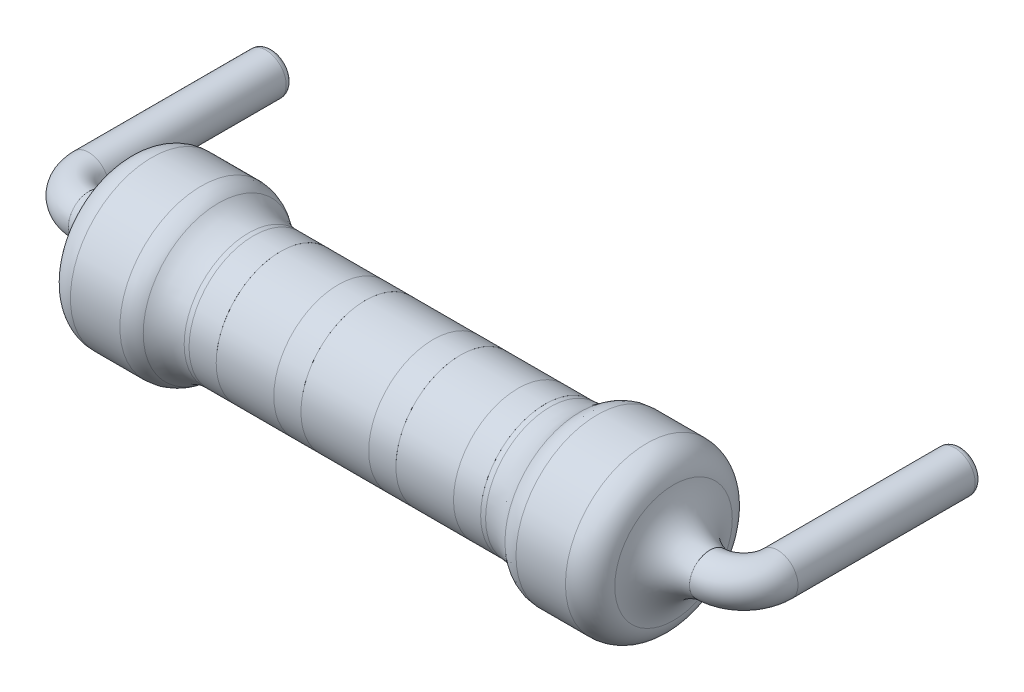
ISO-10303-21;
HEADER;
FILE_DESCRIPTION(('STEP AP214'),'2;1');
FILE_NAME('part.step','',(''),(''),'','','');
FILE_SCHEMA(('AUTOMOTIVE_DESIGN { 1 0 10303 214 1 1 1 1 }'));
ENDSEC;
DATA;
#1=APPLICATION_CONTEXT('core data for automotive mechanical design processes');
#2=APPLICATION_PROTOCOL_DEFINITION('international standard','automotive_design',2000,#1);
#3=PRODUCT_CONTEXT('',#1,'mechanical');
#4=PRODUCT('Part','Part','',(#3));
#5=PRODUCT_RELATED_PRODUCT_CATEGORY('part','',(#4));
#6=PRODUCT_DEFINITION_FORMATION('','',#4);
#7=PRODUCT_DEFINITION_CONTEXT('part definition',#1,'design');
#8=PRODUCT_DEFINITION('design','',#6,#7);
#9=PRODUCT_DEFINITION_SHAPE('','',#8);
#10=(LENGTH_UNIT() NAMED_UNIT(*) SI_UNIT(.MILLI.,.METRE.));
#11=(NAMED_UNIT(*) PLANE_ANGLE_UNIT() SI_UNIT($,.RADIAN.));
#12=(NAMED_UNIT(*) SI_UNIT($,.STERADIAN.) SOLID_ANGLE_UNIT());
#13=UNCERTAINTY_MEASURE_WITH_UNIT(LENGTH_MEASURE(1.E-05),#10,'distance_accuracy_value','');
#14=(GEOMETRIC_REPRESENTATION_CONTEXT(3) GLOBAL_UNCERTAINTY_ASSIGNED_CONTEXT((#13)) GLOBAL_UNIT_ASSIGNED_CONTEXT((#10,
#11,#12)) REPRESENTATION_CONTEXT('',''));
#15=CARTESIAN_POINT('',(0.,0.,0.));
#16=DIRECTION('',(0.,0.,1.));
#17=DIRECTION('',(1.,0.,0.));
#18=AXIS2_PLACEMENT_3D('',#15,#16,#17);
#19=CARTESIAN_POINT('',(-5.08,0.,-1.99999999999996));
#20=DIRECTION('',(-1.33226762955019E-13,0.,1.));
#21=DIRECTION('',(1.,0.,1.33226762955019E-13));
#22=AXIS2_PLACEMENT_3D('',#19,#20,#21);
#23=PLANE('',#22);
#24=CARTESIAN_POINT('',(-5.07999999999999,0.,-1.99999999999996));
#25=DIRECTION('',(-1.33226762955019E-13,0.,1.));
#26=DIRECTION('',(1.,0.,1.32272665043232E-13));
#27=AXIS2_PLACEMENT_3D('',#24,#25,#26);
#28=CIRCLE('',#27,0.2);
#29=CARTESIAN_POINT('',(-4.87999999999999,0.,-1.99999999999994));
#30=VERTEX_POINT('',#29);
#31=CARTESIAN_POINT('',(-5.27999999999999,0.,-1.99999999999999));
#32=VERTEX_POINT('',#31);
#33=EDGE_CURVE('E330',#30,#32,#28,.T.);
#34=ORIENTED_EDGE('',*,*,#33,.F.);
#35=CARTESIAN_POINT('',(-5.07999999999999,0.,-1.99999999999996));
#36=DIRECTION('',(-1.33226762955019E-13,0.,1.));
#37=DIRECTION('',(-1.,0.,-1.32272665043232E-13));
#38=AXIS2_PLACEMENT_3D('',#35,#36,#37);
#39=CIRCLE('',#38,0.2);
#40=EDGE_CURVE('E348',#32,#30,#39,.T.);
#41=ORIENTED_EDGE('',*,*,#40,.F.);
#42=EDGE_LOOP('',(#34,#41));
#43=FACE_BOUND('',#42,.T.);
#44=ADVANCED_FACE('F17',(#43),#23,.F.);
#45=CARTESIAN_POINT('',(5.08,0.,-2.00000000000004));
#46=DIRECTION('',(0.,0.,-1.));
#47=DIRECTION('',(-1.,0.,0.));
#48=AXIS2_PLACEMENT_3D('',#45,#46,#47);
#49=PLANE('',#48);
#50=CARTESIAN_POINT('',(5.08,0.,-2.00000000000004));
#51=DIRECTION('',(0.,0.,1.));
#52=DIRECTION('',(1.,0.,0.));
#53=AXIS2_PLACEMENT_3D('',#50,#51,#52);
#54=CIRCLE('',#53,0.2);
#55=CARTESIAN_POINT('',(5.28,0.,-2.00000000000004));
#56=VERTEX_POINT('',#55);
#57=CARTESIAN_POINT('',(4.88,0.,-2.00000000000003));
#58=VERTEX_POINT('',#57);
#59=EDGE_CURVE('E353',#56,#58,#54,.T.);
#60=ORIENTED_EDGE('',*,*,#59,.F.);
#61=CARTESIAN_POINT('',(5.08,0.,-2.00000000000004));
#62=DIRECTION('',(0.,0.,1.));
#63=DIRECTION('',(-1.,0.,0.));
#64=AXIS2_PLACEMENT_3D('',#61,#62,#63);
#65=CIRCLE('',#64,0.2);
#66=EDGE_CURVE('E38',#58,#56,#65,.T.);
#67=ORIENTED_EDGE('',*,*,#66,.F.);
#68=EDGE_LOOP('',(#60,#67));
#69=FACE_BOUND('',#68,.T.);
#70=ADVANCED_FACE('F503',(#69),#49,.T.);
#71=CARTESIAN_POINT('',(-5.08,0.,-1.89999999999997));
#72=DIRECTION('',(-1.33226762955019E-13,0.,1.));
#73=DIRECTION('',(1.,0.,1.33226762955019E-13));
#74=AXIS2_PLACEMENT_3D('',#71,#72,#73);
#75=TOROIDAL_SURFACE('',#74,0.200000000000001,0.1);
#76=ORIENTED_EDGE('',*,*,#33,.T.);
#77=ORIENTED_EDGE('',*,*,#40,.T.);
#78=EDGE_LOOP('',(#76,#77));
#79=FACE_BOUND('',#78,.T.);
#80=CARTESIAN_POINT('',(-5.08,0.,-1.90000000000002));
#81=DIRECTION('',(0.,0.,-1.));
#82=DIRECTION('',(-1.,0.,0.));
#83=AXIS2_PLACEMENT_3D('',#80,#81,#82);
#84=CIRCLE('',#83,0.3);
#85=CARTESIAN_POINT('',(-5.38,0.,-1.90000000000002));
#86=VERTEX_POINT('',#85);
#87=EDGE_CURVE('E358',#86,#86,#84,.F.);
#88=ORIENTED_EDGE('',*,*,#87,.F.);
#89=EDGE_LOOP('',(#88));
#90=FACE_BOUND('',#89,.T.);
#91=ADVANCED_FACE('F488',(#79,#90),#75,.T.);
#92=CARTESIAN_POINT('',(5.08,0.,-1.90000000000004));
#93=DIRECTION('',(0.,0.,-1.));
#94=DIRECTION('',(-1.,0.,0.));
#95=AXIS2_PLACEMENT_3D('',#92,#93,#94);
#96=TOROIDAL_SURFACE('',#95,0.200000000000001,0.1);
#97=ORIENTED_EDGE('',*,*,#66,.T.);
#98=ORIENTED_EDGE('',*,*,#59,.T.);
#99=EDGE_LOOP('',(#97,#98));
#100=FACE_BOUND('',#99,.T.);
#101=CARTESIAN_POINT('',(5.08,0.,-1.90000000000004));
#102=DIRECTION('',(0.,0.,-1.));
#103=DIRECTION('',(-1.,0.,0.));
#104=AXIS2_PLACEMENT_3D('',#101,#102,#103);
#105=CIRCLE('',#104,0.3);
#106=CARTESIAN_POINT('',(4.78,0.,-1.90000000000004));
#107=VERTEX_POINT('',#106);
#108=EDGE_CURVE('E363',#107,#107,#105,.F.);
#109=ORIENTED_EDGE('',*,*,#108,.F.);
#110=EDGE_LOOP('',(#109));
#111=FACE_BOUND('',#110,.T.);
#112=ADVANCED_FACE('F477',(#100,#111),#96,.T.);
#113=CARTESIAN_POINT('',(-5.08,0.,0.712999999999996));
#114=DIRECTION('',(0.,0.,-1.));
#115=DIRECTION('',(-1.,0.,0.));
#116=AXIS2_PLACEMENT_3D('',#113,#114,#115);
#117=CYLINDRICAL_SURFACE('',#116,0.3);
#118=CARTESIAN_POINT('',(-5.08,0.,0.712999999999971));
#119=DIRECTION('',(0.,0.,-1.));
#120=DIRECTION('',(-1.,0.,0.));
#121=AXIS2_PLACEMENT_3D('',#118,#119,#120);
#122=CIRCLE('',#121,0.3);
#123=CARTESIAN_POINT('',(-5.38,0.,0.712999999999956));
#124=VERTEX_POINT('',#123);
#125=EDGE_CURVE('E371',#124,#124,#122,.F.);
#126=ORIENTED_EDGE('',*,*,#125,.F.);
#127=EDGE_LOOP('',(#126));
#128=FACE_BOUND('',#127,.T.);
#129=ORIENTED_EDGE('',*,*,#87,.T.);
#130=EDGE_LOOP('',(#129));
#131=FACE_BOUND('',#130,.T.);
#132=ADVANCED_FACE('F487',(#128,#131),#117,.T.);
#133=CARTESIAN_POINT('',(5.08,0.,0.712999999999925));
#134=DIRECTION('',(0.,0.,-1.));
#135=DIRECTION('',(-1.,0.,0.));
#136=AXIS2_PLACEMENT_3D('',#133,#134,#135);
#137=CYLINDRICAL_SURFACE('',#136,0.3);
#138=ORIENTED_EDGE('',*,*,#108,.T.);
#139=EDGE_LOOP('',(#138));
#140=FACE_BOUND('',#139,.T.);
#141=CARTESIAN_POINT('',(5.08,0.,0.712999999999949));
#142=DIRECTION('',(0.,0.,1.));
#143=DIRECTION('',(1.,0.,0.));
#144=AXIS2_PLACEMENT_3D('',#141,#142,#143);
#145=CIRCLE('',#144,0.3);
#146=CARTESIAN_POINT('',(5.38,0.,0.712999999999922));
#147=VERTEX_POINT('',#146);
#148=EDGE_CURVE('E1041',#147,#147,#145,.T.);
#149=ORIENTED_EDGE('',*,*,#148,.F.);
#150=EDGE_LOOP('',(#149));
#151=FACE_BOUND('',#150,.T.);
#152=ADVANCED_FACE('F566',(#140,#151),#137,.T.);
#153=CARTESIAN_POINT('',(4.58,0.,0.712999999999995));
#154=DIRECTION('',(0.,-1.,0.));
#155=DIRECTION('',(0.,0.,-1.));
#156=AXIS2_PLACEMENT_3D('',#153,#154,#155);
#157=TOROIDAL_SURFACE('',#156,0.5,0.3);
#158=ORIENTED_EDGE('',*,*,#148,.T.);
#159=EDGE_LOOP('',(#158));
#160=FACE_BOUND('',#159,.T.);
#161=CARTESIAN_POINT('',(4.58000000000004,0.,1.213));
#162=DIRECTION('',(-1.,0.,0.));
#163=DIRECTION('',(0.,0.,1.));
#164=AXIS2_PLACEMENT_3D('',#161,#162,#163);
#165=CIRCLE('',#164,0.299999999999992);
#166=CARTESIAN_POINT('',(4.58000000000004,0.,1.51299999999999));
#167=VERTEX_POINT('',#166);
#168=EDGE_CURVE('E407',#167,#167,#165,.F.);
#169=ORIENTED_EDGE('',*,*,#168,.T.);
#170=EDGE_LOOP('',(#169));
#171=FACE_BOUND('',#170,.T.);
#172=ADVANCED_FACE('F572',(#160,#171),#157,.T.);
#173=CARTESIAN_POINT('',(-4.58,0.,0.712999999999996));
#174=DIRECTION('',(0.,-1.,0.));
#175=DIRECTION('',(0.,0.,-1.));
#176=AXIS2_PLACEMENT_3D('',#173,#174,#175);
#177=TOROIDAL_SURFACE('',#176,0.500000000000001,0.3);
#178=CARTESIAN_POINT('',(-4.58000000000004,0.,1.213));
#179=DIRECTION('',(-1.,0.,0.));
#180=DIRECTION('',(0.,0.,1.));
#181=AXIS2_PLACEMENT_3D('',#178,#179,#180);
#182=CIRCLE('',#181,0.299999999999992);
#183=CARTESIAN_POINT('',(-4.58000000000004,0.,1.51299999999999));
#184=VERTEX_POINT('',#183);
#185=EDGE_CURVE('E404',#184,#184,#182,.T.);
#186=ORIENTED_EDGE('',*,*,#185,.T.);
#187=EDGE_LOOP('',(#186));
#188=FACE_BOUND('',#187,.T.);
#189=ORIENTED_EDGE('',*,*,#125,.T.);
#190=EDGE_LOOP('',(#189));
#191=FACE_BOUND('',#190,.T.);
#192=ADVANCED_FACE('F578',(#188,#191),#177,.T.);
#193=CARTESIAN_POINT('',(4.7347238018244,0.,1.213));
#194=DIRECTION('',(-1.,0.,0.));
#195=DIRECTION('',(0.,0.,1.));
#196=AXIS2_PLACEMENT_3D('',#193,#194,#195);
#197=TOROIDAL_SURFACE('',#196,0.982686271393386,0.7);
#198=ORIENTED_EDGE('',*,*,#168,.F.);
#199=EDGE_LOOP('',(#198));
#200=FACE_BOUND('',#199,.T.);
#201=CARTESIAN_POINT('',(4.04444501884524,0.,1.213));
#202=DIRECTION('',(1.,0.,0.));
#203=DIRECTION('',(0.,0.,-1.));
#204=AXIS2_PLACEMENT_3D('',#201,#202,#203);
#205=CIRCLE('',#204,0.866431371415776);
#206=CARTESIAN_POINT('',(4.04444501884524,0.,0.34656862858422));
#207=VERTEX_POINT('',#206);
#208=EDGE_CURVE('E403',#207,#207,#205,.F.);
#209=ORIENTED_EDGE('',*,*,#208,.F.);
#210=EDGE_LOOP('',(#209));
#211=FACE_BOUND('',#210,.T.);
#212=ADVANCED_FACE('F585',(#200,#211),#197,.F.);
#213=CARTESIAN_POINT('',(-4.7347238018244,0.,1.213));
#214=DIRECTION('',(-1.,0.,0.));
#215=DIRECTION('',(0.,0.,1.));
#216=AXIS2_PLACEMENT_3D('',#213,#214,#215);
#217=TOROIDAL_SURFACE('',#216,0.982686271393386,0.7);
#218=CARTESIAN_POINT('',(-4.04444501884524,0.,1.213));
#219=DIRECTION('',(1.,0.,0.));
#220=DIRECTION('',(0.,0.,-1.));
#221=AXIS2_PLACEMENT_3D('',#218,#219,#220);
#222=CIRCLE('',#221,0.866431371415784);
#223=CARTESIAN_POINT('',(-4.04444501884524,0.,0.346568628584212));
#224=VERTEX_POINT('',#223);
#225=EDGE_CURVE('E399',#224,#224,#222,.T.);
#226=ORIENTED_EDGE('',*,*,#225,.F.);
#227=EDGE_LOOP('',(#226));
#228=FACE_BOUND('',#227,.T.);
#229=ORIENTED_EDGE('',*,*,#185,.F.);
#230=EDGE_LOOP('',(#229));
#231=FACE_BOUND('',#230,.T.);
#232=ADVANCED_FACE('F592',(#228,#231),#217,.F.);
#233=CARTESIAN_POINT('',(3.65,0.,1.213));
#234=DIRECTION('',(1.,0.,0.));
#235=DIRECTION('',(0.,0.,-1.));
#236=AXIS2_PLACEMENT_3D('',#233,#234,#235);
#237=TOROIDAL_SURFACE('',#236,0.8,0.4);
#238=ORIENTED_EDGE('',*,*,#208,.T.);
#239=EDGE_LOOP('',(#238));
#240=FACE_BOUND('',#239,.T.);
#241=CARTESIAN_POINT('',(3.65,0.,1.213));
#242=DIRECTION('',(-1.,0.,0.));
#243=DIRECTION('',(0.,0.,1.));
#244=AXIS2_PLACEMENT_3D('',#241,#242,#243);
#245=CIRCLE('',#244,1.2);
#246=CARTESIAN_POINT('',(3.65,0.,2.413));
#247=VERTEX_POINT('',#246);
#248=EDGE_CURVE('E398',#247,#247,#245,.T.);
#249=ORIENTED_EDGE('',*,*,#248,.F.);
#250=EDGE_LOOP('',(#249));
#251=FACE_BOUND('',#250,.T.);
#252=ADVANCED_FACE('F599',(#240,#251),#237,.T.);
#253=CARTESIAN_POINT('',(-3.65,0.,1.213));
#254=DIRECTION('',(1.,0.,0.));
#255=DIRECTION('',(0.,0.,-1.));
#256=AXIS2_PLACEMENT_3D('',#253,#254,#255);
#257=TOROIDAL_SURFACE('',#256,0.8,0.4);
#258=ORIENTED_EDGE('',*,*,#225,.T.);
#259=EDGE_LOOP('',(#258));
#260=FACE_BOUND('',#259,.T.);
#261=CARTESIAN_POINT('',(-3.65,0.,1.213));
#262=DIRECTION('',(1.,0.,0.));
#263=DIRECTION('',(0.,0.,-1.));
#264=AXIS2_PLACEMENT_3D('',#261,#262,#263);
#265=CIRCLE('',#264,1.2);
#266=CARTESIAN_POINT('',(-3.65,0.,0.0129999999999961));
#267=VERTEX_POINT('',#266);
#268=EDGE_CURVE('E395',#267,#267,#265,.T.);
#269=ORIENTED_EDGE('',*,*,#268,.F.);
#270=EDGE_LOOP('',(#269));
#271=FACE_BOUND('',#270,.T.);
#272=ADVANCED_FACE('F606',(#260,#271),#257,.T.);
#273=CARTESIAN_POINT('',(4.05,0.,1.213));
#274=DIRECTION('',(-1.,0.,0.));
#275=DIRECTION('',(0.,0.,1.));
#276=AXIS2_PLACEMENT_3D('',#273,#274,#275);
#277=CYLINDRICAL_SURFACE('',#276,1.2);
#278=ORIENTED_EDGE('',*,*,#248,.T.);
#279=EDGE_LOOP('',(#278));
#280=FACE_BOUND('',#279,.T.);
#281=CARTESIAN_POINT('',(2.92080992435478,0.,1.213));
#282=DIRECTION('',(-1.,0.,0.));
#283=DIRECTION('',(0.,0.,1.));
#284=AXIS2_PLACEMENT_3D('',#281,#282,#283);
#285=CIRCLE('',#284,1.2);
#286=CARTESIAN_POINT('',(2.92080992435478,0.,2.413));
#287=VERTEX_POINT('',#286);
#288=EDGE_CURVE('E394',#287,#287,#285,.T.);
#289=ORIENTED_EDGE('',*,*,#288,.F.);
#290=EDGE_LOOP('',(#289));
#291=FACE_BOUND('',#290,.T.);
#292=ADVANCED_FACE('F613',(#280,#291),#277,.T.);
#293=CARTESIAN_POINT('',(-4.05,0.,1.213));
#294=DIRECTION('',(1.,0.,0.));
#295=DIRECTION('',(0.,0.,-1.));
#296=AXIS2_PLACEMENT_3D('',#293,#294,#295);
#297=CYLINDRICAL_SURFACE('',#296,1.2);
#298=ORIENTED_EDGE('',*,*,#268,.T.);
#299=EDGE_LOOP('',(#298));
#300=FACE_BOUND('',#299,.T.);
#301=CARTESIAN_POINT('',(-2.92080992435478,0.,1.213));
#302=DIRECTION('',(1.,0.,0.));
#303=DIRECTION('',(0.,0.,-1.));
#304=AXIS2_PLACEMENT_3D('',#301,#302,#303);
#305=CIRCLE('',#304,1.2);
#306=CARTESIAN_POINT('',(-2.92080992435478,0.,0.0129999999999961));
#307=VERTEX_POINT('',#306);
#308=EDGE_CURVE('E390',#307,#307,#305,.T.);
#309=ORIENTED_EDGE('',*,*,#308,.F.);
#310=EDGE_LOOP('',(#309));
#311=FACE_BOUND('',#310,.T.);
#312=ADVANCED_FACE('F620',(#300,#311),#297,.T.);
#313=CARTESIAN_POINT('',(2.92080992435478,0.,1.213));
#314=DIRECTION('',(-1.,0.,0.));
#315=DIRECTION('',(0.,0.,1.));
#316=AXIS2_PLACEMENT_3D('',#313,#314,#315);
#317=TOROIDAL_SURFACE('',#316,0.8,0.4);
#318=ORIENTED_EDGE('',*,*,#288,.T.);
#319=EDGE_LOOP('',(#318));
#320=FACE_BOUND('',#319,.T.);
#321=CARTESIAN_POINT('',(2.66691465083171,0.,1.213));
#322=DIRECTION('',(-1.,0.,0.));
#323=DIRECTION('',(0.,0.,1.));
#324=AXIS2_PLACEMENT_3D('',#321,#322,#323);
#325=CIRCLE('',#324,1.10909090909091);
#326=CARTESIAN_POINT('',(2.66691465083171,0.,2.3220909090909));
#327=VERTEX_POINT('',#326);
#328=EDGE_CURVE('E389',#327,#327,#325,.F.);
#329=ORIENTED_EDGE('',*,*,#328,.T.);
#330=EDGE_LOOP('',(#329));
#331=FACE_BOUND('',#330,.T.);
#332=ADVANCED_FACE('F627',(#320,#331),#317,.T.);
#333=CARTESIAN_POINT('',(-2.92080992435478,0.,1.213));
#334=DIRECTION('',(1.,0.,0.));
#335=DIRECTION('',(0.,0.,-1.));
#336=AXIS2_PLACEMENT_3D('',#333,#334,#335);
#337=TOROIDAL_SURFACE('',#336,0.8,0.4);
#338=ORIENTED_EDGE('',*,*,#308,.T.);
#339=EDGE_LOOP('',(#338));
#340=FACE_BOUND('',#339,.T.);
#341=CARTESIAN_POINT('',(-2.66691465083171,0.,1.213));
#342=DIRECTION('',(-1.,0.,0.));
#343=DIRECTION('',(0.,0.,1.));
#344=AXIS2_PLACEMENT_3D('',#341,#342,#343);
#345=CIRCLE('',#344,1.10909090909091);
#346=CARTESIAN_POINT('',(-2.66691465083171,0.,2.3220909090909));
#347=VERTEX_POINT('',#346);
#348=EDGE_CURVE('E382',#347,#347,#345,.T.);
#349=ORIENTED_EDGE('',*,*,#348,.T.);
#350=EDGE_LOOP('',(#349));
#351=FACE_BOUND('',#350,.T.);
#352=ADVANCED_FACE('F634',(#340,#351),#337,.T.);
#353=CARTESIAN_POINT('',(2.22259792216634,0.,1.213));
#354=DIRECTION('',(-1.,0.,0.));
#355=DIRECTION('',(0.,0.,1.));
#356=AXIS2_PLACEMENT_3D('',#353,#354,#355);
#357=TOROIDAL_SURFACE('',#356,1.65,0.7);
#358=ORIENTED_EDGE('',*,*,#328,.F.);
#359=EDGE_LOOP('',(#358));
#360=FACE_BOUND('',#359,.T.);
#361=CARTESIAN_POINT('',(2.22259792216634,0.,1.213));
#362=DIRECTION('',(-1.,0.,0.));
#363=DIRECTION('',(0.,0.,1.));
#364=AXIS2_PLACEMENT_3D('',#361,#362,#363);
#365=CIRCLE('',#364,0.95);
#366=CARTESIAN_POINT('',(2.22259792216634,0.,2.163));
#367=VERTEX_POINT('',#366);
#368=EDGE_CURVE('E378',#367,#367,#365,.T.);
#369=ORIENTED_EDGE('',*,*,#368,.F.);
#370=EDGE_LOOP('',(#369));
#371=FACE_BOUND('',#370,.T.);
#372=ADVANCED_FACE('F641',(#360,#371),#357,.F.);
#373=CARTESIAN_POINT('',(-2.22259792216634,0.,1.213));
#374=DIRECTION('',(-1.,0.,0.));
#375=DIRECTION('',(0.,0.,1.));
#376=AXIS2_PLACEMENT_3D('',#373,#374,#375);
#377=TOROIDAL_SURFACE('',#376,1.65,0.7);
#378=CARTESIAN_POINT('',(-2.22259792216634,0.,1.213));
#379=DIRECTION('',(-1.,0.,0.));
#380=DIRECTION('',(0.,0.,1.));
#381=AXIS2_PLACEMENT_3D('',#378,#379,#380);
#382=CIRCLE('',#381,0.95);
#383=CARTESIAN_POINT('',(-2.22259792216634,0.,2.163));
#384=VERTEX_POINT('',#383);
#385=EDGE_CURVE('E381',#384,#384,#382,.F.);
#386=ORIENTED_EDGE('',*,*,#385,.F.);
#387=EDGE_LOOP('',(#386));
#388=FACE_BOUND('',#387,.T.);
#389=ORIENTED_EDGE('',*,*,#348,.F.);
#390=EDGE_LOOP('',(#389));
#391=FACE_BOUND('',#390,.T.);
#392=ADVANCED_FACE('F648',(#388,#391),#377,.F.);
#393=CARTESIAN_POINT('',(5.23700576850888,0.,1.213));
#394=DIRECTION('',(-1.,0.,0.));
#395=DIRECTION('',(0.,0.,1.));
#396=AXIS2_PLACEMENT_3D('',#393,#394,#395);
#397=CYLINDRICAL_SURFACE('',#396,0.95);
#398=ORIENTED_EDGE('',*,*,#368,.T.);
#399=EDGE_LOOP('',(#398));
#400=FACE_BOUND('',#399,.T.);
#401=CARTESIAN_POINT('',(2.15,0.,1.213));
#402=DIRECTION('',(-1.,0.,0.));
#403=DIRECTION('',(0.,0.,1.));
#404=AXIS2_PLACEMENT_3D('',#401,#402,#403);
#405=CIRCLE('',#404,0.95);
#406=CARTESIAN_POINT('',(2.15,0.,2.16325));
#407=VERTEX_POINT('',#406);
#408=CARTESIAN_POINT('',(2.15,0.,0.262749999999996));
#409=VERTEX_POINT('',#408);
#410=EDGE_CURVE('E110',#407,#409,#405,.T.);
#411=ORIENTED_EDGE('',*,*,#410,.F.);
#412=CARTESIAN_POINT('',(2.15,0.,1.213));
#413=DIRECTION('',(1.,0.,0.));
#414=DIRECTION('',(0.,0.,1.));
#415=AXIS2_PLACEMENT_3D('',#412,#413,#414);
#416=CIRCLE('',#415,0.95);
#417=EDGE_CURVE('E335',#407,#409,#416,.T.);
#418=ORIENTED_EDGE('',*,*,#417,.T.);
#419=EDGE_LOOP('',(#411,#418));
#420=FACE_BOUND('',#419,.T.);
#421=ADVANCED_FACE('F655',(#400,#420),#397,.T.);
#422=CARTESIAN_POINT('',(5.23700576850888,0.,1.213));
#423=DIRECTION('',(-1.,0.,0.));
#424=DIRECTION('',(0.,0.,1.));
#425=AXIS2_PLACEMENT_3D('',#422,#423,#424);
#426=CYLINDRICAL_SURFACE('',#425,0.95);
#427=CARTESIAN_POINT('',(-2.15,0.,1.213));
#428=DIRECTION('',(-1.,0.,0.));
#429=DIRECTION('',(0.,0.,1.));
#430=AXIS2_PLACEMENT_3D('',#427,#428,#429);
#431=CIRCLE('',#430,0.95);
#432=CARTESIAN_POINT('',(-2.15,0.,2.16325));
#433=VERTEX_POINT('',#432);
#434=CARTESIAN_POINT('',(-2.15,0.,0.262749999999996));
#435=VERTEX_POINT('',#434);
#436=EDGE_CURVE('E99',#433,#435,#431,.T.);
#437=ORIENTED_EDGE('',*,*,#436,.T.);
#438=CARTESIAN_POINT('',(-2.15,0.,1.213));
#439=DIRECTION('',(1.,0.,0.));
#440=DIRECTION('',(0.,0.,1.));
#441=AXIS2_PLACEMENT_3D('',#438,#439,#440);
#442=CIRCLE('',#441,0.9505);
#443=EDGE_CURVE('E108',#433,#435,#442,.T.);
#444=ORIENTED_EDGE('',*,*,#443,.F.);
#445=EDGE_LOOP('',(#437,#444));
#446=FACE_BOUND('',#445,.T.);
#447=ORIENTED_EDGE('',*,*,#385,.T.);
#448=EDGE_LOOP('',(#447));
#449=FACE_BOUND('',#448,.T.);
#450=ADVANCED_FACE('F106',(#446,#449),#426,.T.);
#451=CARTESIAN_POINT('',(2.15,0.,1.213));
#452=DIRECTION('',(1.,0.,0.));
#453=DIRECTION('',(0.,0.,-1.));
#454=AXIS2_PLACEMENT_3D('',#451,#452,#453);
#455=PLANE('',#454);
#456=ORIENTED_EDGE('',*,*,#410,.T.);
#457=CARTESIAN_POINT('',(2.15,0.,1.213));
#458=DIRECTION('',(-1.,0.,0.));
#459=DIRECTION('',(0.,0.,1.));
#460=AXIS2_PLACEMENT_3D('',#457,#458,#459);
#461=CIRCLE('',#460,0.9505);
#462=EDGE_CURVE('E103',#407,#409,#461,.T.);
#463=ORIENTED_EDGE('',*,*,#462,.F.);
#464=EDGE_LOOP('',(#456,#463));
#465=FACE_BOUND('',#464,.T.);
#466=ADVANCED_FACE('F668',(#465),#455,.T.);
#467=CARTESIAN_POINT('',(-2.15,0.,1.213));
#468=DIRECTION('',(1.,0.,0.));
#469=DIRECTION('',(0.,0.,-1.));
#470=AXIS2_PLACEMENT_3D('',#467,#468,#469);
#471=PLANE('',#470);
#472=ORIENTED_EDGE('',*,*,#436,.F.);
#473=CARTESIAN_POINT('',(-2.15,0.,1.213));
#474=DIRECTION('',(1.,0.,0.));
#475=DIRECTION('',(0.,0.,-1.));
#476=AXIS2_PLACEMENT_3D('',#473,#474,#475);
#477=CIRCLE('',#476,0.9505);
#478=EDGE_CURVE('E94',#435,#433,#477,.T.);
#479=ORIENTED_EDGE('',*,*,#478,.F.);
#480=EDGE_LOOP('',(#472,#479));
#481=FACE_BOUND('',#480,.T.);
#482=ADVANCED_FACE('F98',(#481),#471,.F.);
#483=CARTESIAN_POINT('',(2.15,0.,1.213));
#484=DIRECTION('',(-1.,0.,0.));
#485=DIRECTION('',(0.,0.,1.));
#486=AXIS2_PLACEMENT_3D('',#483,#484,#485);
#487=CYLINDRICAL_SURFACE('',#486,0.9505);
#488=ORIENTED_EDGE('',*,*,#462,.T.);
#489=ORIENTED_EDGE('',*,*,#417,.F.);
#490=EDGE_LOOP('',(#488,#489));
#491=FACE_BOUND('',#490,.T.);
#492=CARTESIAN_POINT('',(1.75,0.,1.213));
#493=DIRECTION('',(-1.,0.,0.));
#494=DIRECTION('',(0.,0.,1.));
#495=AXIS2_PLACEMENT_3D('',#492,#493,#494);
#496=CIRCLE('',#495,0.9505);
#497=CARTESIAN_POINT('',(1.75,0.,0.262749999999996));
#498=VERTEX_POINT('',#497);
#499=CARTESIAN_POINT('',(1.75,0.,2.16325));
#500=VERTEX_POINT('',#499);
#501=EDGE_CURVE('E102',#498,#500,#496,.F.);
#502=ORIENTED_EDGE('',*,*,#501,.T.);
#503=CARTESIAN_POINT('',(1.75,0.,1.213));
#504=DIRECTION('',(1.,0.,0.));
#505=DIRECTION('',(0.,0.,1.));
#506=AXIS2_PLACEMENT_3D('',#503,#504,#505);
#507=CIRCLE('',#506,0.9505);
#508=EDGE_CURVE('E324',#500,#498,#507,.T.);
#509=ORIENTED_EDGE('',*,*,#508,.T.);
#510=EDGE_LOOP('',(#502,#509));
#511=FACE_BOUND('',#510,.T.);
#512=ADVANCED_FACE('F135',(#491,#511),#487,.T.);
#513=CARTESIAN_POINT('',(-2.15,0.,1.213));
#514=DIRECTION('',(1.,0.,0.));
#515=DIRECTION('',(0.,0.,-1.));
#516=AXIS2_PLACEMENT_3D('',#513,#514,#515);
#517=CYLINDRICAL_SURFACE('',#516,0.9505);
#518=ORIENTED_EDGE('',*,*,#478,.T.);
#519=ORIENTED_EDGE('',*,*,#443,.T.);
#520=EDGE_LOOP('',(#518,#519));
#521=FACE_BOUND('',#520,.T.);
#522=CARTESIAN_POINT('',(-1.75,0.,1.213));
#523=DIRECTION('',(1.,0.,0.));
#524=DIRECTION('',(0.,0.,-1.));
#525=AXIS2_PLACEMENT_3D('',#522,#523,#524);
#526=CIRCLE('',#525,0.9505);
#527=CARTESIAN_POINT('',(-1.75,0.,0.262749999999996));
#528=VERTEX_POINT('',#527);
#529=CARTESIAN_POINT('',(-1.75,0.,2.16325));
#530=VERTEX_POINT('',#529);
#531=EDGE_CURVE('E307',#528,#530,#526,.T.);
#532=ORIENTED_EDGE('',*,*,#531,.F.);
#533=CARTESIAN_POINT('',(-1.75,0.,1.213));
#534=DIRECTION('',(1.,0.,0.));
#535=DIRECTION('',(0.,0.,1.));
#536=AXIS2_PLACEMENT_3D('',#533,#534,#535);
#537=CIRCLE('',#536,0.95);
#538=EDGE_CURVE('E116',#530,#528,#537,.T.);
#539=ORIENTED_EDGE('',*,*,#538,.F.);
#540=EDGE_LOOP('',(#532,#539));
#541=FACE_BOUND('',#540,.T.);
#542=ADVANCED_FACE('F113',(#521,#541),#517,.T.);
#543=CARTESIAN_POINT('',(1.75,0.,1.213));
#544=DIRECTION('',(1.,0.,0.));
#545=DIRECTION('',(0.,0.,-1.));
#546=AXIS2_PLACEMENT_3D('',#543,#544,#545);
#547=PLANE('',#546);
#548=CARTESIAN_POINT('',(1.75,0.,1.213));
#549=DIRECTION('',(-1.,0.,0.));
#550=DIRECTION('',(0.,0.,1.));
#551=AXIS2_PLACEMENT_3D('',#548,#549,#550);
#552=CIRCLE('',#551,0.95);
#553=EDGE_CURVE('E447',#500,#498,#552,.T.);
#554=ORIENTED_EDGE('',*,*,#553,.F.);
#555=ORIENTED_EDGE('',*,*,#501,.F.);
#556=EDGE_LOOP('',(#554,#555));
#557=FACE_BOUND('',#556,.T.);
#558=ADVANCED_FACE('F134',(#557),#547,.F.);
#559=CARTESIAN_POINT('',(-1.75,0.,1.213));
#560=DIRECTION('',(1.,0.,0.));
#561=DIRECTION('',(0.,0.,-1.));
#562=AXIS2_PLACEMENT_3D('',#559,#560,#561);
#563=PLANE('',#562);
#564=ORIENTED_EDGE('',*,*,#531,.T.);
#565=CARTESIAN_POINT('',(-1.75,0.,1.213));
#566=DIRECTION('',(-1.,0.,0.));
#567=DIRECTION('',(0.,0.,1.));
#568=AXIS2_PLACEMENT_3D('',#565,#566,#567);
#569=CIRCLE('',#568,0.95);
#570=EDGE_CURVE('E442',#528,#530,#569,.F.);
#571=ORIENTED_EDGE('',*,*,#570,.F.);
#572=EDGE_LOOP('',(#564,#571));
#573=FACE_BOUND('',#572,.T.);
#574=ADVANCED_FACE('F180',(#573),#563,.T.);
#575=CARTESIAN_POINT('',(5.23700576850888,0.,1.213));
#576=DIRECTION('',(-1.,0.,0.));
#577=DIRECTION('',(0.,0.,1.));
#578=AXIS2_PLACEMENT_3D('',#575,#576,#577);
#579=CYLINDRICAL_SURFACE('',#578,0.95);
#580=ORIENTED_EDGE('',*,*,#553,.T.);
#581=ORIENTED_EDGE('',*,*,#508,.F.);
#582=EDGE_LOOP('',(#580,#581));
#583=FACE_BOUND('',#582,.T.);
#584=CARTESIAN_POINT('',(0.9,0.,1.213));
#585=DIRECTION('',(-1.,0.,0.));
#586=DIRECTION('',(0.,0.,1.));
#587=AXIS2_PLACEMENT_3D('',#584,#585,#586);
#588=CIRCLE('',#587,0.95);
#589=CARTESIAN_POINT('',(0.9,0.,2.16325));
#590=VERTEX_POINT('',#589);
#591=CARTESIAN_POINT('',(0.9,0.,0.262749999999996));
#592=VERTEX_POINT('',#591);
#593=EDGE_CURVE('E437',#590,#592,#588,.T.);
#594=ORIENTED_EDGE('',*,*,#593,.F.);
#595=CARTESIAN_POINT('',(0.9,0.,1.213));
#596=DIRECTION('',(1.,0.,0.));
#597=DIRECTION('',(0.,0.,1.));
#598=AXIS2_PLACEMENT_3D('',#595,#596,#597);
#599=CIRCLE('',#598,0.95);
#600=EDGE_CURVE('E163',#590,#592,#599,.T.);
#601=ORIENTED_EDGE('',*,*,#600,.T.);
#602=EDGE_LOOP('',(#594,#601));
#603=FACE_BOUND('',#602,.T.);
#604=ADVANCED_FACE('F170',(#583,#603),#579,.T.);
#605=CARTESIAN_POINT('',(5.23700576850888,0.,1.213));
#606=DIRECTION('',(-1.,0.,0.));
#607=DIRECTION('',(0.,0.,1.));
#608=AXIS2_PLACEMENT_3D('',#605,#606,#607);
#609=CYLINDRICAL_SURFACE('',#608,0.95);
#610=CARTESIAN_POINT('',(-0.9,0.,1.213));
#611=DIRECTION('',(-1.,0.,0.));
#612=DIRECTION('',(0.,0.,1.));
#613=AXIS2_PLACEMENT_3D('',#610,#611,#612);
#614=CIRCLE('',#613,0.95);
#615=CARTESIAN_POINT('',(-0.9,0.,2.16325));
#616=VERTEX_POINT('',#615);
#617=CARTESIAN_POINT('',(-0.9,0.,0.262749999999996));
#618=VERTEX_POINT('',#617);
#619=EDGE_CURVE('E432',#616,#618,#614,.T.);
#620=ORIENTED_EDGE('',*,*,#619,.T.);
#621=CARTESIAN_POINT('',(-0.9,0.,1.213));
#622=DIRECTION('',(1.,0.,0.));
#623=DIRECTION('',(0.,0.,1.));
#624=AXIS2_PLACEMENT_3D('',#621,#622,#623);
#625=CIRCLE('',#624,0.9505);
#626=EDGE_CURVE('E274',#616,#618,#625,.T.);
#627=ORIENTED_EDGE('',*,*,#626,.F.);
#628=EDGE_LOOP('',(#620,#627));
#629=FACE_BOUND('',#628,.T.);
#630=ORIENTED_EDGE('',*,*,#570,.T.);
#631=ORIENTED_EDGE('',*,*,#538,.T.);
#632=EDGE_LOOP('',(#630,#631));
#633=FACE_BOUND('',#632,.T.);
#634=ADVANCED_FACE('F179',(#629,#633),#609,.T.);
#635=CARTESIAN_POINT('',(0.9,0.,1.213));
#636=DIRECTION('',(1.,0.,0.));
#637=DIRECTION('',(0.,0.,-1.));
#638=AXIS2_PLACEMENT_3D('',#635,#636,#637);
#639=PLANE('',#638);
#640=CARTESIAN_POINT('',(0.9,0.,1.213));
#641=DIRECTION('',(-1.,0.,0.));
#642=DIRECTION('',(0.,0.,1.));
#643=AXIS2_PLACEMENT_3D('',#640,#641,#642);
#644=CIRCLE('',#643,0.9505);
#645=EDGE_CURVE('E427',#590,#592,#644,.T.);
#646=ORIENTED_EDGE('',*,*,#645,.F.);
#647=ORIENTED_EDGE('',*,*,#593,.T.);
#648=EDGE_LOOP('',(#646,#647));
#649=FACE_BOUND('',#648,.T.);
#650=ADVANCED_FACE('F701',(#649),#639,.T.);
#651=CARTESIAN_POINT('',(-0.9,0.,1.213));
#652=DIRECTION('',(1.,0.,0.));
#653=DIRECTION('',(0.,0.,-1.));
#654=AXIS2_PLACEMENT_3D('',#651,#652,#653);
#655=PLANE('',#654);
#656=ORIENTED_EDGE('',*,*,#619,.F.);
#657=CARTESIAN_POINT('',(-0.9,0.,1.213));
#658=DIRECTION('',(1.,0.,0.));
#659=DIRECTION('',(0.,0.,-1.));
#660=AXIS2_PLACEMENT_3D('',#657,#658,#659);
#661=CIRCLE('',#660,0.9505);
#662=EDGE_CURVE('E422',#618,#616,#661,.T.);
#663=ORIENTED_EDGE('',*,*,#662,.F.);
#664=EDGE_LOOP('',(#656,#663));
#665=FACE_BOUND('',#664,.T.);
#666=ADVANCED_FACE('F215',(#665),#655,.F.);
#667=CARTESIAN_POINT('',(0.9,0.,1.213));
#668=DIRECTION('',(-1.,0.,0.));
#669=DIRECTION('',(0.,0.,1.));
#670=AXIS2_PLACEMENT_3D('',#667,#668,#669);
#671=CYLINDRICAL_SURFACE('',#670,0.9505);
#672=ORIENTED_EDGE('',*,*,#645,.T.);
#673=ORIENTED_EDGE('',*,*,#600,.F.);
#674=EDGE_LOOP('',(#672,#673));
#675=FACE_BOUND('',#674,.T.);
#676=CARTESIAN_POINT('',(0.5,0.,1.213));
#677=DIRECTION('',(-1.,0.,0.));
#678=DIRECTION('',(0.,0.,1.));
#679=AXIS2_PLACEMENT_3D('',#676,#677,#678);
#680=CIRCLE('',#679,0.9505);
#681=CARTESIAN_POINT('',(0.5,0.,0.262749999999996));
#682=VERTEX_POINT('',#681);
#683=CARTESIAN_POINT('',(0.5,0.,2.16325));
#684=VERTEX_POINT('',#683);
#685=EDGE_CURVE('E417',#682,#684,#680,.F.);
#686=ORIENTED_EDGE('',*,*,#685,.T.);
#687=CARTESIAN_POINT('',(0.5,0.,1.213));
#688=DIRECTION('',(1.,0.,0.));
#689=DIRECTION('',(0.,0.,1.));
#690=AXIS2_PLACEMENT_3D('',#687,#688,#689);
#691=CIRCLE('',#690,0.9505);
#692=EDGE_CURVE('E198',#684,#682,#691,.T.);
#693=ORIENTED_EDGE('',*,*,#692,.T.);
#694=EDGE_LOOP('',(#686,#693));
#695=FACE_BOUND('',#694,.T.);
#696=ADVANCED_FACE('F204',(#675,#695),#671,.T.);
#697=CARTESIAN_POINT('',(-0.9,0.,1.213));
#698=DIRECTION('',(1.,0.,0.));
#699=DIRECTION('',(0.,0.,-1.));
#700=AXIS2_PLACEMENT_3D('',#697,#698,#699);
#701=CYLINDRICAL_SURFACE('',#700,0.9505);
#702=ORIENTED_EDGE('',*,*,#662,.T.);
#703=ORIENTED_EDGE('',*,*,#626,.T.);
#704=EDGE_LOOP('',(#702,#703));
#705=FACE_BOUND('',#704,.T.);
#706=CARTESIAN_POINT('',(-0.5,0.,1.213));
#707=DIRECTION('',(1.,0.,0.));
#708=DIRECTION('',(0.,0.,-1.));
#709=AXIS2_PLACEMENT_3D('',#706,#707,#708);
#710=CIRCLE('',#709,0.9505);
#711=CARTESIAN_POINT('',(-0.5,0.,0.262749999999996));
#712=VERTEX_POINT('',#711);
#713=CARTESIAN_POINT('',(-0.5,0.,2.16325));
#714=VERTEX_POINT('',#713);
#715=EDGE_CURVE('E412',#712,#714,#710,.T.);
#716=ORIENTED_EDGE('',*,*,#715,.F.);
#717=CARTESIAN_POINT('',(-0.5,0.,1.213));
#718=DIRECTION('',(1.,0.,0.));
#719=DIRECTION('',(0.,0.,1.));
#720=AXIS2_PLACEMENT_3D('',#717,#718,#719);
#721=CIRCLE('',#720,0.95);
#722=EDGE_CURVE('E232',#714,#712,#721,.T.);
#723=ORIENTED_EDGE('',*,*,#722,.F.);
#724=EDGE_LOOP('',(#716,#723));
#725=FACE_BOUND('',#724,.T.);
#726=ADVANCED_FACE('F214',(#705,#725),#701,.T.);
#727=CARTESIAN_POINT('',(0.5,0.,1.213));
#728=DIRECTION('',(1.,0.,0.));
#729=DIRECTION('',(0.,0.,-1.));
#730=AXIS2_PLACEMENT_3D('',#727,#728,#729);
#731=PLANE('',#730);
#732=ORIENTED_EDGE('',*,*,#685,.F.);
#733=CARTESIAN_POINT('',(0.5,0.,1.213));
#734=DIRECTION('',(-1.,0.,0.));
#735=DIRECTION('',(0.,0.,1.));
#736=AXIS2_PLACEMENT_3D('',#733,#734,#735);
#737=CIRCLE('',#736,0.95);
#738=EDGE_CURVE('E30',#684,#682,#737,.T.);
#739=ORIENTED_EDGE('',*,*,#738,.F.);
#740=EDGE_LOOP('',(#732,#739));
#741=FACE_BOUND('',#740,.T.);
#742=ADVANCED_FACE('F719',(#741),#731,.F.);
#743=CARTESIAN_POINT('',(-0.5,0.,1.213));
#744=DIRECTION('',(1.,0.,0.));
#745=DIRECTION('',(0.,0.,-1.));
#746=AXIS2_PLACEMENT_3D('',#743,#744,#745);
#747=PLANE('',#746);
#748=ORIENTED_EDGE('',*,*,#715,.T.);
#749=CARTESIAN_POINT('',(-0.5,0.,1.213));
#750=DIRECTION('',(-1.,0.,0.));
#751=DIRECTION('',(0.,0.,1.));
#752=AXIS2_PLACEMENT_3D('',#749,#750,#751);
#753=CIRCLE('',#752,0.95);
#754=EDGE_CURVE('E11',#712,#714,#753,.F.);
#755=ORIENTED_EDGE('',*,*,#754,.F.);
#756=EDGE_LOOP('',(#748,#755));
#757=FACE_BOUND('',#756,.T.);
#758=ADVANCED_FACE('F247',(#757),#747,.T.);
#759=CARTESIAN_POINT('',(5.23700576850888,0.,1.213));
#760=DIRECTION('',(-1.,0.,0.));
#761=DIRECTION('',(0.,0.,1.));
#762=AXIS2_PLACEMENT_3D('',#759,#760,#761);
#763=CYLINDRICAL_SURFACE('',#762,0.95);
#764=ORIENTED_EDGE('',*,*,#738,.T.);
#765=ORIENTED_EDGE('',*,*,#692,.F.);
#766=EDGE_LOOP('',(#764,#765));
#767=FACE_BOUND('',#766,.T.);
#768=ORIENTED_EDGE('',*,*,#754,.T.);
#769=ORIENTED_EDGE('',*,*,#722,.T.);
#770=EDGE_LOOP('',(#768,#769));
#771=FACE_BOUND('',#770,.T.);
#772=ADVANCED_FACE('F238',(#767,#771),#763,.T.);
#773=CLOSED_SHELL('',(#44,#70,#91,#112,#132,#152,#172,#192,#212,#232,#252,#272,#292,#312,#332,
#352,#372,#392,#421,#450,#466,#482,#512,#542,#558,#574,#604,#634,#650,#666,#696,#726,#742,#758,#772));
#774=MANIFOLD_SOLID_BREP('B1',#773);
#775=ADVANCED_BREP_SHAPE_REPRESENTATION('',(#18,#774),#14);
#776=SHAPE_DEFINITION_REPRESENTATION(#9,#775);
ENDSEC;
END-ISO-10303-21;
